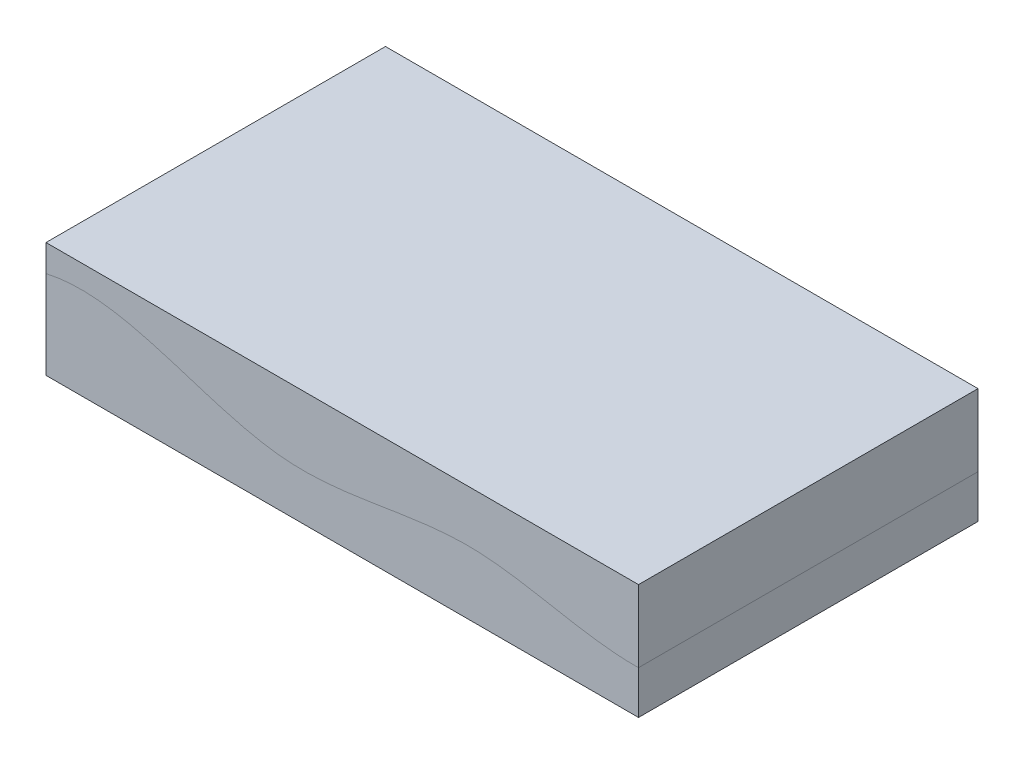
ISO-10303-21;
HEADER;
FILE_DESCRIPTION(('STEP AP214'),'2;1');
FILE_NAME('part.step','',(''),(''),'','','');
FILE_SCHEMA(('AUTOMOTIVE_DESIGN { 1 0 10303 214 1 1 1 1 }'));
ENDSEC;
DATA;
#1=APPLICATION_CONTEXT('core data for automotive mechanical design processes');
#2=APPLICATION_PROTOCOL_DEFINITION('international standard','automotive_design',2000,#1);
#3=PRODUCT_CONTEXT('',#1,'mechanical');
#4=PRODUCT('Part','Part','',(#3));
#5=PRODUCT_RELATED_PRODUCT_CATEGORY('part','',(#4));
#6=PRODUCT_DEFINITION_FORMATION('','',#4);
#7=PRODUCT_DEFINITION_CONTEXT('part definition',#1,'design');
#8=PRODUCT_DEFINITION('design','',#6,#7);
#9=PRODUCT_DEFINITION_SHAPE('','',#8);
#10=(LENGTH_UNIT() NAMED_UNIT(*) SI_UNIT(.MILLI.,.METRE.));
#11=(NAMED_UNIT(*) PLANE_ANGLE_UNIT() SI_UNIT($,.RADIAN.));
#12=(NAMED_UNIT(*) SI_UNIT($,.STERADIAN.) SOLID_ANGLE_UNIT());
#13=UNCERTAINTY_MEASURE_WITH_UNIT(LENGTH_MEASURE(1.E-05),#10,'distance_accuracy_value','');
#14=(GEOMETRIC_REPRESENTATION_CONTEXT(3) GLOBAL_UNCERTAINTY_ASSIGNED_CONTEXT((#13)) GLOBAL_UNIT_ASSIGNED_CONTEXT((#10,
#11,#12)) REPRESENTATION_CONTEXT('',''));
#15=CARTESIAN_POINT('',(0.,0.,0.));
#16=DIRECTION('',(0.,0.,1.));
#17=DIRECTION('',(1.,0.,0.));
#18=AXIS2_PLACEMENT_3D('',#15,#16,#17);
#19=CARTESIAN_POINT('',(-161.644624089461,19.8067246725839,73.7450334603377));
#20=CARTESIAN_POINT('',(-115.329461229494,63.0712297169528,73.7450334603377));
#21=CARTESIAN_POINT('',(-45.3047261573765,1.35192563319905,73.7450334603377));
#22=CARTESIAN_POINT('',(65.8617627356163,41.0813265380425,73.7450334603377));
#23=CARTESIAN_POINT('',(127.592388482558,8.01350352662468,73.7450334603377));
#24=CARTESIAN_POINT('',(163.31249639305,27.5901287559973,73.7450334603377));
#25=B_SPLINE_CURVE_WITH_KNOTS('',3,(#19,#20,#21,#22,#23,#24),.UNSPECIFIED.,.F.,.F.,(4,1,1,4),
(0.,0.428404103159151,0.673907151988384,1.),.UNSPECIFIED.);
#26=DIRECTION('',(0.,0.,1.));
#27=VECTOR('',#26,1.);
#28=SURFACE_OF_LINEAR_EXTRUSION('',#25,#27);
#29=CARTESIAN_POINT('',(-161.644624089461,19.8067246725839,73.7450334603377));
#30=CARTESIAN_POINT('',(-115.329461229494,63.0712297169528,73.7450334603377));
#31=CARTESIAN_POINT('',(-45.3047261573765,1.35192563319905,73.7450334603377));
#32=CARTESIAN_POINT('',(65.8617627356163,41.0813265380425,73.7450334603377));
#33=CARTESIAN_POINT('',(127.592388482558,8.01350352662468,73.7450334603377));
#34=CARTESIAN_POINT('',(163.31249639305,27.5901287559973,73.7450334603377));
#35=B_SPLINE_CURVE_WITH_KNOTS('',3,(#29,#30,#31,#32,#33,#34),.UNSPECIFIED.,.F.,.F.,(4,1,1,4),
(0.,0.428404103159151,0.673907151988384,1.),.UNSPECIFIED.);
#36=CARTESIAN_POINT('',(128.71182062639,18.7430461767188,73.7450334603377));
#37=VERTEX_POINT('',#36);
#38=CARTESIAN_POINT('',(-128.71182062639,38.3002633867609,73.7450334603377));
#39=VERTEX_POINT('',#38);
#40=EDGE_CURVE('E124',#37,#39,#35,.F.);
#41=ORIENTED_EDGE('',*,*,#40,.T.);
#42=DIRECTION('',(0.,0.,1.));
#43=VECTOR('',#42,1.);
#44=CARTESIAN_POINT('',(-128.71182062639,38.3002633867609,73.7450334603377));
#45=LINE('',#44,#43);
#46=CARTESIAN_POINT('',(-128.71182062639,38.3002633867609,-73.7450334603377));
#47=VERTEX_POINT('',#46);
#48=EDGE_CURVE('E111',#39,#47,#45,.F.);
#49=ORIENTED_EDGE('',*,*,#48,.T.);
#50=CARTESIAN_POINT('',(-161.644624089461,19.8067246725839,-73.7450334603377));
#51=CARTESIAN_POINT('',(-115.329461229494,63.0712297169528,-73.7450334603377));
#52=CARTESIAN_POINT('',(-45.3047261573765,1.35192563319905,-73.7450334603377));
#53=CARTESIAN_POINT('',(65.8617627356163,41.0813265380425,-73.7450334603377));
#54=CARTESIAN_POINT('',(127.592388482558,8.01350352662468,-73.7450334603377));
#55=CARTESIAN_POINT('',(163.31249639305,27.5901287559973,-73.7450334603377));
#56=B_SPLINE_CURVE_WITH_KNOTS('',3,(#50,#51,#52,#53,#54,#55),.UNSPECIFIED.,.F.,.F.,(4,1,1,4),
(0.,0.428404103159151,0.673907151988384,1.),.UNSPECIFIED.);
#57=CARTESIAN_POINT('',(128.71182062639,18.7430461767188,-73.7450334603377));
#58=VERTEX_POINT('',#57);
#59=EDGE_CURVE('E122',#47,#58,#56,.T.);
#60=ORIENTED_EDGE('',*,*,#59,.T.);
#61=DIRECTION('',(0.,0.,1.));
#62=VECTOR('',#61,1.);
#63=CARTESIAN_POINT('',(128.71182062639,18.7430461767188,73.7450334603377));
#64=LINE('',#63,#62);
#65=EDGE_CURVE('E130',#58,#37,#64,.T.);
#66=ORIENTED_EDGE('',*,*,#65,.T.);
#67=EDGE_LOOP('',(#41,#49,#60,#66));
#68=FACE_BOUND('',#67,.T.);
#69=ADVANCED_FACE('F67',(#68),#28,.T.);
#70=CARTESIAN_POINT('',(-128.71182062639,50.,73.7450334603377));
#71=DIRECTION('',(1.,0.,0.));
#72=DIRECTION('',(0.,0.,-1.));
#73=AXIS2_PLACEMENT_3D('',#70,#71,#72);
#74=PLANE('',#73);
#75=ORIENTED_EDGE('',*,*,#48,.F.);
#76=DIRECTION('',(0.,-1.,0.));
#77=VECTOR('',#76,1.);
#78=CARTESIAN_POINT('',(-128.71182062639,50.,73.7450334603377));
#79=LINE('',#78,#77);
#80=CARTESIAN_POINT('',(-128.71182062639,50.,73.7450334603377));
#81=VERTEX_POINT('',#80);
#82=EDGE_CURVE('E125',#81,#39,#79,.T.);
#83=ORIENTED_EDGE('',*,*,#82,.F.);
#84=DIRECTION('',(0.,0.,1.));
#85=VECTOR('',#84,1.);
#86=CARTESIAN_POINT('',(-128.71182062639,50.,73.7450334603377));
#87=LINE('',#86,#85);
#88=CARTESIAN_POINT('',(-128.71182062639,50.,-73.7450334603377));
#89=VERTEX_POINT('',#88);
#90=EDGE_CURVE('E12',#89,#81,#87,.T.);
#91=ORIENTED_EDGE('',*,*,#90,.F.);
#92=DIRECTION('',(0.,-1.,0.));
#93=VECTOR('',#92,1.);
#94=CARTESIAN_POINT('',(-128.71182062639,50.,-73.7450334603377));
#95=LINE('',#94,#93);
#96=EDGE_CURVE('E107',#89,#47,#95,.T.);
#97=ORIENTED_EDGE('',*,*,#96,.T.);
#98=EDGE_LOOP('',(#75,#83,#91,#97));
#99=FACE_BOUND('',#98,.T.);
#100=ADVANCED_FACE('F109',(#99),#74,.F.);
#101=CARTESIAN_POINT('',(128.71182062639,50.,73.7450334603377));
#102=DIRECTION('',(0.,0.,-1.));
#103=DIRECTION('',(-1.,0.,0.));
#104=AXIS2_PLACEMENT_3D('',#101,#102,#103);
#105=PLANE('',#104);
#106=ORIENTED_EDGE('',*,*,#40,.F.);
#107=DIRECTION('',(0.,-1.,0.));
#108=VECTOR('',#107,1.);
#109=CARTESIAN_POINT('',(128.71182062639,50.,73.7450334603377));
#110=LINE('',#109,#108);
#111=CARTESIAN_POINT('',(128.71182062639,50.,73.7450334603377));
#112=VERTEX_POINT('',#111);
#113=EDGE_CURVE('E145',#112,#37,#110,.T.);
#114=ORIENTED_EDGE('',*,*,#113,.F.);
#115=DIRECTION('',(1.,0.,0.));
#116=VECTOR('',#115,1.);
#117=CARTESIAN_POINT('',(128.71182062639,50.,73.7450334603377));
#118=LINE('',#117,#116);
#119=EDGE_CURVE('E77',#81,#112,#118,.T.);
#120=ORIENTED_EDGE('',*,*,#119,.F.);
#121=ORIENTED_EDGE('',*,*,#82,.T.);
#122=EDGE_LOOP('',(#106,#114,#120,#121));
#123=FACE_BOUND('',#122,.T.);
#124=ADVANCED_FACE('F155',(#123),#105,.F.);
#125=CARTESIAN_POINT('',(128.71182062639,50.,73.7450334603377));
#126=DIRECTION('',(-1.,0.,0.));
#127=DIRECTION('',(0.,0.,1.));
#128=AXIS2_PLACEMENT_3D('',#125,#126,#127);
#129=PLANE('',#128);
#130=ORIENTED_EDGE('',*,*,#65,.F.);
#131=DIRECTION('',(0.,-1.,0.));
#132=VECTOR('',#131,1.);
#133=CARTESIAN_POINT('',(128.71182062639,50.,-73.7450334603377));
#134=LINE('',#133,#132);
#135=CARTESIAN_POINT('',(128.71182062639,50.,-73.7450334603377));
#136=VERTEX_POINT('',#135);
#137=EDGE_CURVE('E117',#136,#58,#134,.T.);
#138=ORIENTED_EDGE('',*,*,#137,.F.);
#139=DIRECTION('',(0.,0.,-1.));
#140=VECTOR('',#139,1.);
#141=CARTESIAN_POINT('',(128.71182062639,50.,73.7450334603377));
#142=LINE('',#141,#140);
#143=EDGE_CURVE('E149',#112,#136,#142,.T.);
#144=ORIENTED_EDGE('',*,*,#143,.F.);
#145=ORIENTED_EDGE('',*,*,#113,.T.);
#146=EDGE_LOOP('',(#130,#138,#144,#145));
#147=FACE_BOUND('',#146,.T.);
#148=ADVANCED_FACE('F154',(#147),#129,.F.);
#149=CARTESIAN_POINT('',(128.71182062639,50.,-73.7450334603377));
#150=DIRECTION('',(0.,0.,1.));
#151=DIRECTION('',(1.,0.,0.));
#152=AXIS2_PLACEMENT_3D('',#149,#150,#151);
#153=PLANE('',#152);
#154=ORIENTED_EDGE('',*,*,#59,.F.);
#155=ORIENTED_EDGE('',*,*,#96,.F.);
#156=DIRECTION('',(-1.,0.,0.));
#157=VECTOR('',#156,1.);
#158=CARTESIAN_POINT('',(128.71182062639,50.,-73.7450334603377));
#159=LINE('',#158,#157);
#160=EDGE_CURVE('E116',#136,#89,#159,.T.);
#161=ORIENTED_EDGE('',*,*,#160,.F.);
#162=ORIENTED_EDGE('',*,*,#137,.T.);
#163=EDGE_LOOP('',(#154,#155,#161,#162));
#164=FACE_BOUND('',#163,.T.);
#165=ADVANCED_FACE('F127',(#164),#153,.F.);
#166=CARTESIAN_POINT('',(0.,50.,0.));
#167=DIRECTION('',(0.,1.,0.));
#168=DIRECTION('',(0.,0.,1.));
#169=AXIS2_PLACEMENT_3D('',#166,#167,#168);
#170=PLANE('',#169);
#171=ORIENTED_EDGE('',*,*,#90,.T.);
#172=ORIENTED_EDGE('',*,*,#119,.T.);
#173=ORIENTED_EDGE('',*,*,#143,.T.);
#174=ORIENTED_EDGE('',*,*,#160,.T.);
#175=EDGE_LOOP('',(#171,#172,#173,#174));
#176=FACE_BOUND('',#175,.T.);
#177=ADVANCED_FACE('F151',(#176),#170,.T.);
#178=CLOSED_SHELL('',(#69,#100,#124,#148,#165,#177));
#179=MANIFOLD_SOLID_BREP('B2',#178);
#180=CARTESIAN_POINT('',(-161.644624089461,19.8067246725839,73.7450334603377));
#181=CARTESIAN_POINT('',(-115.329461229494,63.0712297169528,73.7450334603377));
#182=CARTESIAN_POINT('',(-45.3047261573765,1.35192563319905,73.7450334603377));
#183=CARTESIAN_POINT('',(65.8617627356163,41.0813265380425,73.7450334603377));
#184=CARTESIAN_POINT('',(127.592388482558,8.01350352662468,73.7450334603377));
#185=CARTESIAN_POINT('',(163.31249639305,27.5901287559973,73.7450334603377));
#186=B_SPLINE_CURVE_WITH_KNOTS('',3,(#180,#181,#182,#183,#184,#185),.UNSPECIFIED.,.F.,.F.,(4,1,
1,4),(0.,0.428404103159151,0.673907151988384,1.),.UNSPECIFIED.);
#187=DIRECTION('',(0.,0.,1.));
#188=VECTOR('',#187,1.);
#189=SURFACE_OF_LINEAR_EXTRUSION('',#186,#188);
#190=CARTESIAN_POINT('',(-161.644624089461,19.8067246725839,73.7450334603377));
#191=CARTESIAN_POINT('',(-115.329461229494,63.0712297169528,73.7450334603377));
#192=CARTESIAN_POINT('',(-45.3047261573765,1.35192563319905,73.7450334603377));
#193=CARTESIAN_POINT('',(65.8617627356163,41.0813265380425,73.7450334603377));
#194=CARTESIAN_POINT('',(127.592388482558,8.01350352662468,73.7450334603377));
#195=CARTESIAN_POINT('',(163.31249639305,27.5901287559973,73.7450334603377));
#196=B_SPLINE_CURVE_WITH_KNOTS('',3,(#190,#191,#192,#193,#194,#195),.UNSPECIFIED.,.F.,.F.,(4,1,
1,4),(0.,0.428404103159151,0.673907151988384,1.),.UNSPECIFIED.);
#197=CARTESIAN_POINT('',(128.71182062639,18.7430461767188,73.7450334603377));
#198=VERTEX_POINT('',#197);
#199=CARTESIAN_POINT('',(-128.71182062639,38.3002633867609,73.7450334603377));
#200=VERTEX_POINT('',#199);
#201=EDGE_CURVE('E216',#198,#200,#196,.F.);
#202=ORIENTED_EDGE('',*,*,#201,.F.);
#203=DIRECTION('',(0.,0.,1.));
#204=VECTOR('',#203,1.);
#205=CARTESIAN_POINT('',(128.71182062639,18.7430461767188,73.7450334603377));
#206=LINE('',#205,#204);
#207=CARTESIAN_POINT('',(128.71182062639,18.7430461767188,-73.7450334603377));
#208=VERTEX_POINT('',#207);
#209=EDGE_CURVE('E279',#208,#198,#206,.T.);
#210=ORIENTED_EDGE('',*,*,#209,.F.);
#211=CARTESIAN_POINT('',(-161.644624089461,19.8067246725839,-73.7450334603377));
#212=CARTESIAN_POINT('',(-115.329461229494,63.0712297169528,-73.7450334603377));
#213=CARTESIAN_POINT('',(-45.3047261573765,1.35192563319905,-73.7450334603377));
#214=CARTESIAN_POINT('',(65.8617627356163,41.0813265380425,-73.7450334603377));
#215=CARTESIAN_POINT('',(127.592388482558,8.01350352662468,-73.7450334603377));
#216=CARTESIAN_POINT('',(163.31249639305,27.5901287559973,-73.7450334603377));
#217=B_SPLINE_CURVE_WITH_KNOTS('',3,(#211,#212,#213,#214,#215,#216),.UNSPECIFIED.,.F.,.F.,(4,1,
1,4),(0.,0.428404103159151,0.673907151988384,1.),.UNSPECIFIED.);
#218=CARTESIAN_POINT('',(-128.71182062639,38.3002633867609,-73.7450334603377));
#219=VERTEX_POINT('',#218);
#220=EDGE_CURVE('E228',#219,#208,#217,.T.);
#221=ORIENTED_EDGE('',*,*,#220,.F.);
#222=DIRECTION('',(0.,0.,1.));
#223=VECTOR('',#222,1.);
#224=CARTESIAN_POINT('',(-128.71182062639,38.3002633867609,73.7450334603377));
#225=LINE('',#224,#223);
#226=EDGE_CURVE('E65',#200,#219,#225,.F.);
#227=ORIENTED_EDGE('',*,*,#226,.F.);
#228=EDGE_LOOP('',(#202,#210,#221,#227));
#229=FACE_BOUND('',#228,.T.);
#230=ADVANCED_FACE('F208',(#229),#189,.F.);
#231=CARTESIAN_POINT('',(128.71182062639,50.,73.7450334603377));
#232=DIRECTION('',(0.,0.,-1.));
#233=DIRECTION('',(-1.,0.,0.));
#234=AXIS2_PLACEMENT_3D('',#231,#232,#233);
#235=PLANE('',#234);
#236=DIRECTION('',(0.,-1.,0.));
#237=VECTOR('',#236,1.);
#238=CARTESIAN_POINT('',(128.71182062639,50.,73.7450334603377));
#239=LINE('',#238,#237);
#240=CARTESIAN_POINT('',(128.71182062639,0.,73.7450334603377));
#241=VERTEX_POINT('',#240);
#242=EDGE_CURVE('E255',#198,#241,#239,.T.);
#243=ORIENTED_EDGE('',*,*,#242,.F.);
#244=ORIENTED_EDGE('',*,*,#201,.T.);
#245=DIRECTION('',(0.,-1.,0.));
#246=VECTOR('',#245,1.);
#247=CARTESIAN_POINT('',(-128.71182062639,50.,73.7450334603377));
#248=LINE('',#247,#246);
#249=CARTESIAN_POINT('',(-128.71182062639,0.,73.7450334603377));
#250=VERTEX_POINT('',#249);
#251=EDGE_CURVE('E247',#200,#250,#248,.T.);
#252=ORIENTED_EDGE('',*,*,#251,.T.);
#253=DIRECTION('',(1.,0.,0.));
#254=VECTOR('',#253,1.);
#255=CARTESIAN_POINT('',(128.71182062639,0.,73.7450334603377));
#256=LINE('',#255,#254);
#257=EDGE_CURVE('E251',#250,#241,#256,.T.);
#258=ORIENTED_EDGE('',*,*,#257,.T.);
#259=EDGE_LOOP('',(#243,#244,#252,#258));
#260=FACE_BOUND('',#259,.T.);
#261=ADVANCED_FACE('F250',(#260),#235,.F.);
#262=CARTESIAN_POINT('',(0.,0.,0.));
#263=DIRECTION('',(0.,1.,0.));
#264=DIRECTION('',(0.,0.,1.));
#265=AXIS2_PLACEMENT_3D('',#262,#263,#264);
#266=PLANE('',#265);
#267=DIRECTION('',(0.,0.,1.));
#268=VECTOR('',#267,1.);
#269=CARTESIAN_POINT('',(-128.71182062639,0.,73.7450334603377));
#270=LINE('',#269,#268);
#271=CARTESIAN_POINT('',(-128.71182062639,0.,-73.7450334603377));
#272=VERTEX_POINT('',#271);
#273=EDGE_CURVE('E261',#272,#250,#270,.T.);
#274=ORIENTED_EDGE('',*,*,#273,.F.);
#275=DIRECTION('',(-1.,0.,0.));
#276=VECTOR('',#275,1.);
#277=CARTESIAN_POINT('',(128.71182062639,0.,-73.7450334603377));
#278=LINE('',#277,#276);
#279=CARTESIAN_POINT('',(128.71182062639,0.,-73.7450334603377));
#280=VERTEX_POINT('',#279);
#281=EDGE_CURVE('E271',#280,#272,#278,.T.);
#282=ORIENTED_EDGE('',*,*,#281,.F.);
#283=DIRECTION('',(0.,0.,-1.));
#284=VECTOR('',#283,1.);
#285=CARTESIAN_POINT('',(128.71182062639,0.,73.7450334603377));
#286=LINE('',#285,#284);
#287=EDGE_CURVE('E263',#241,#280,#286,.T.);
#288=ORIENTED_EDGE('',*,*,#287,.F.);
#289=ORIENTED_EDGE('',*,*,#257,.F.);
#290=EDGE_LOOP('',(#274,#282,#288,#289));
#291=FACE_BOUND('',#290,.T.);
#292=ADVANCED_FACE('F259',(#291),#266,.F.);
#293=CARTESIAN_POINT('',(128.71182062639,50.,73.7450334603377));
#294=DIRECTION('',(-1.,0.,0.));
#295=DIRECTION('',(0.,0.,1.));
#296=AXIS2_PLACEMENT_3D('',#293,#294,#295);
#297=PLANE('',#296);
#298=DIRECTION('',(0.,-1.,0.));
#299=VECTOR('',#298,1.);
#300=CARTESIAN_POINT('',(128.71182062639,50.,-73.7450334603377));
#301=LINE('',#300,#299);
#302=EDGE_CURVE('E274',#208,#280,#301,.T.);
#303=ORIENTED_EDGE('',*,*,#302,.F.);
#304=ORIENTED_EDGE('',*,*,#209,.T.);
#305=ORIENTED_EDGE('',*,*,#242,.T.);
#306=ORIENTED_EDGE('',*,*,#287,.T.);
#307=EDGE_LOOP('',(#303,#304,#305,#306));
#308=FACE_BOUND('',#307,.T.);
#309=ADVANCED_FACE('F297',(#308),#297,.F.);
#310=CARTESIAN_POINT('',(-128.71182062639,50.,73.7450334603377));
#311=DIRECTION('',(1.,0.,0.));
#312=DIRECTION('',(0.,0.,-1.));
#313=AXIS2_PLACEMENT_3D('',#310,#311,#312);
#314=PLANE('',#313);
#315=ORIENTED_EDGE('',*,*,#251,.F.);
#316=ORIENTED_EDGE('',*,*,#226,.T.);
#317=DIRECTION('',(0.,-1.,0.));
#318=VECTOR('',#317,1.);
#319=CARTESIAN_POINT('',(-128.71182062639,50.,-73.7450334603377));
#320=LINE('',#319,#318);
#321=EDGE_CURVE('E266',#219,#272,#320,.T.);
#322=ORIENTED_EDGE('',*,*,#321,.T.);
#323=ORIENTED_EDGE('',*,*,#273,.T.);
#324=EDGE_LOOP('',(#315,#316,#322,#323));
#325=FACE_BOUND('',#324,.T.);
#326=ADVANCED_FACE('F265',(#325),#314,.F.);
#327=CARTESIAN_POINT('',(128.71182062639,50.,-73.7450334603377));
#328=DIRECTION('',(0.,0.,1.));
#329=DIRECTION('',(1.,0.,0.));
#330=AXIS2_PLACEMENT_3D('',#327,#328,#329);
#331=PLANE('',#330);
#332=ORIENTED_EDGE('',*,*,#321,.F.);
#333=ORIENTED_EDGE('',*,*,#220,.T.);
#334=ORIENTED_EDGE('',*,*,#302,.T.);
#335=ORIENTED_EDGE('',*,*,#281,.T.);
#336=EDGE_LOOP('',(#332,#333,#334,#335));
#337=FACE_BOUND('',#336,.T.);
#338=ADVANCED_FACE('F299',(#337),#331,.F.);
#339=CLOSED_SHELL('',(#230,#261,#292,#309,#326,#338));
#340=MANIFOLD_SOLID_BREP('B6',#339);
#341=ADVANCED_BREP_SHAPE_REPRESENTATION('',(#18,#179,#340),#14);
#342=SHAPE_DEFINITION_REPRESENTATION(#9,#341);
ENDSEC;
END-ISO-10303-21;
